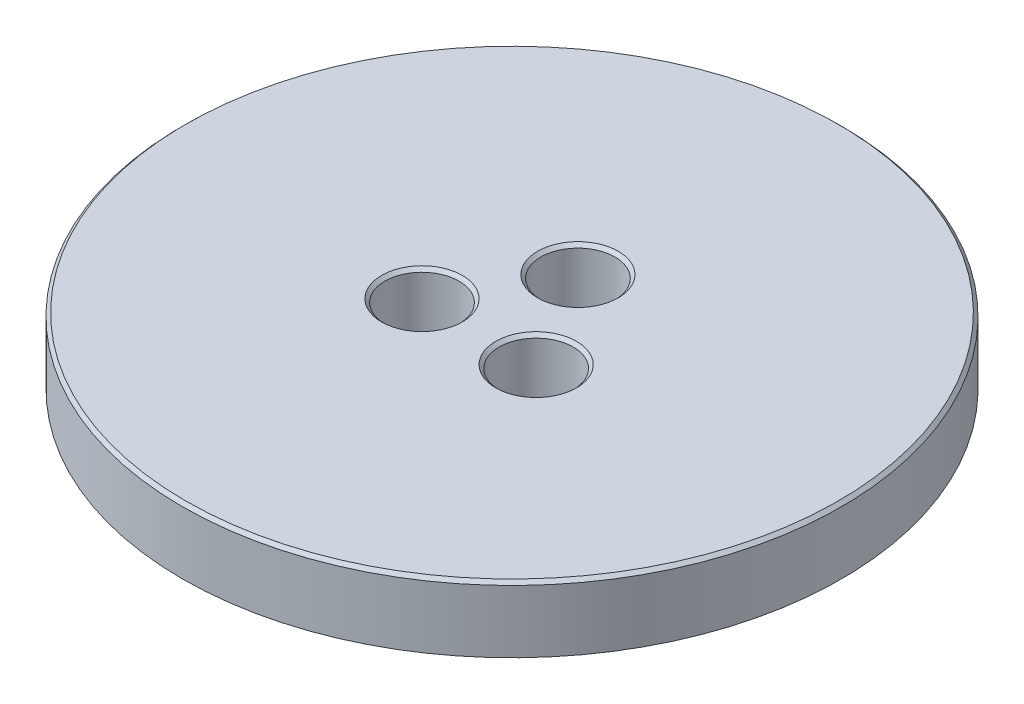
ISO-10303-21;
HEADER;
FILE_DESCRIPTION(('STEP AP214'),'2;1');
FILE_NAME('part.step','',(''),(''),'','','');
FILE_SCHEMA(('AUTOMOTIVE_DESIGN { 1 0 10303 214 1 1 1 1 }'));
ENDSEC;
DATA;
#1=APPLICATION_CONTEXT('core data for automotive mechanical design processes');
#2=APPLICATION_PROTOCOL_DEFINITION('international standard','automotive_design',2000,#1);
#3=PRODUCT_CONTEXT('',#1,'mechanical');
#4=PRODUCT('Part','Part','',(#3));
#5=PRODUCT_RELATED_PRODUCT_CATEGORY('part','',(#4));
#6=PRODUCT_DEFINITION_FORMATION('','',#4);
#7=PRODUCT_DEFINITION_CONTEXT('part definition',#1,'design');
#8=PRODUCT_DEFINITION('design','',#6,#7);
#9=PRODUCT_DEFINITION_SHAPE('','',#8);
#10=(LENGTH_UNIT() NAMED_UNIT(*) SI_UNIT(.MILLI.,.METRE.));
#11=(NAMED_UNIT(*) PLANE_ANGLE_UNIT() SI_UNIT($,.RADIAN.));
#12=(NAMED_UNIT(*) SI_UNIT($,.STERADIAN.) SOLID_ANGLE_UNIT());
#13=UNCERTAINTY_MEASURE_WITH_UNIT(LENGTH_MEASURE(1.E-05),#10,'distance_accuracy_value','');
#14=(GEOMETRIC_REPRESENTATION_CONTEXT(3) GLOBAL_UNCERTAINTY_ASSIGNED_CONTEXT((#13)) GLOBAL_UNIT_ASSIGNED_CONTEXT((#10,
#11,#12)) REPRESENTATION_CONTEXT('',''));
#15=CARTESIAN_POINT('',(0.,0.,0.));
#16=DIRECTION('',(0.,0.,1.));
#17=DIRECTION('',(1.,0.,0.));
#18=AXIS2_PLACEMENT_3D('',#15,#16,#17);
#19=CARTESIAN_POINT('',(0.,2.,0.));
#20=DIRECTION('',(0.,1.,0.));
#21=DIRECTION('',(0.,0.,1.));
#22=AXIS2_PLACEMENT_3D('',#19,#20,#21);
#23=PLANE('',#22);
#24=CARTESIAN_POINT('',(0.,2.,0.));
#25=DIRECTION('',(0.,1.,0.));
#26=DIRECTION('',(0.,0.,1.));
#27=AXIS2_PLACEMENT_3D('',#24,#25,#26);
#28=CIRCLE('',#27,9.9);
#29=CARTESIAN_POINT('',(0.,2.,9.9));
#30=VERTEX_POINT('',#29);
#31=EDGE_CURVE('E50',#30,#30,#28,.T.);
#32=ORIENTED_EDGE('',*,*,#31,.T.);
#33=EDGE_LOOP('',(#32));
#34=FACE_BOUND('',#33,.T.);
#35=CARTESIAN_POINT('',(1.73205080756888,2.,1.));
#36=DIRECTION('',(0.,1.,0.));
#37=DIRECTION('',(0.,0.,1.));
#38=AXIS2_PLACEMENT_3D('',#35,#36,#37);
#39=CIRCLE('',#38,1.225);
#40=CARTESIAN_POINT('',(1.73205080756888,2.,2.225));
#41=VERTEX_POINT('',#40);
#42=EDGE_CURVE('E55',#41,#41,#39,.F.);
#43=ORIENTED_EDGE('',*,*,#42,.T.);
#44=EDGE_LOOP('',(#43));
#45=FACE_BOUND('',#44,.T.);
#46=CARTESIAN_POINT('',(-1.73205080756888,2.,1.));
#47=DIRECTION('',(0.,1.,0.));
#48=DIRECTION('',(0.,0.,1.));
#49=AXIS2_PLACEMENT_3D('',#46,#47,#48);
#50=CIRCLE('',#49,1.225);
#51=CARTESIAN_POINT('',(-1.73205080756888,2.,2.225));
#52=VERTEX_POINT('',#51);
#53=EDGE_CURVE('E58',#52,#52,#50,.F.);
#54=ORIENTED_EDGE('',*,*,#53,.T.);
#55=EDGE_LOOP('',(#54));
#56=FACE_BOUND('',#55,.T.);
#57=CARTESIAN_POINT('',(0.,2.,-2.));
#58=DIRECTION('',(0.,1.,0.));
#59=DIRECTION('',(0.,0.,1.));
#60=AXIS2_PLACEMENT_3D('',#57,#58,#59);
#61=CIRCLE('',#60,1.225);
#62=CARTESIAN_POINT('',(0.,2.,-0.775));
#63=VERTEX_POINT('',#62);
#64=EDGE_CURVE('E61',#63,#63,#61,.F.);
#65=ORIENTED_EDGE('',*,*,#64,.T.);
#66=EDGE_LOOP('',(#65));
#67=FACE_BOUND('',#66,.T.);
#68=ADVANCED_FACE('F34',(#34,#45,#56,#67),#23,.T.);
#69=CARTESIAN_POINT('',(0.,0.,0.));
#70=DIRECTION('',(0.,-1.,0.));
#71=DIRECTION('',(0.,0.,-1.));
#72=AXIS2_PLACEMENT_3D('',#69,#70,#71);
#73=CYLINDRICAL_SURFACE('',#72,10.);
#74=CARTESIAN_POINT('',(0.,1.9,0.));
#75=DIRECTION('',(0.,1.,0.));
#76=DIRECTION('',(0.,0.,1.));
#77=AXIS2_PLACEMENT_3D('',#74,#75,#76);
#78=CIRCLE('',#77,10.);
#79=CARTESIAN_POINT('',(0.,1.9,10.));
#80=VERTEX_POINT('',#79);
#81=EDGE_CURVE('E64',#80,#80,#78,.F.);
#82=ORIENTED_EDGE('',*,*,#81,.T.);
#83=EDGE_LOOP('',(#82));
#84=FACE_BOUND('',#83,.T.);
#85=CARTESIAN_POINT('',(0.,0.,0.));
#86=DIRECTION('',(0.,-1.,0.));
#87=DIRECTION('',(0.,0.,-1.));
#88=AXIS2_PLACEMENT_3D('',#85,#86,#87);
#89=CIRCLE('',#88,10.);
#90=CARTESIAN_POINT('',(0.,0.,-10.));
#91=VERTEX_POINT('',#90);
#92=EDGE_CURVE('E67',#91,#91,#89,.T.);
#93=ORIENTED_EDGE('',*,*,#92,.F.);
#94=EDGE_LOOP('',(#93));
#95=FACE_BOUND('',#94,.T.);
#96=ADVANCED_FACE('F98',(#84,#95),#73,.T.);
#97=CARTESIAN_POINT('',(0.,0.,0.));
#98=DIRECTION('',(0.,-1.,0.));
#99=DIRECTION('',(0.,0.,-1.));
#100=AXIS2_PLACEMENT_3D('',#97,#98,#99);
#101=PLANE('',#100);
#102=CARTESIAN_POINT('',(0.,0.,-2.));
#103=DIRECTION('',(0.,1.,0.));
#104=DIRECTION('',(0.,0.,1.));
#105=AXIS2_PLACEMENT_3D('',#102,#103,#104);
#106=CIRCLE('',#105,1.125);
#107=CARTESIAN_POINT('',(0.,0.,-0.875));
#108=VERTEX_POINT('',#107);
#109=EDGE_CURVE('E70',#108,#108,#106,.T.);
#110=ORIENTED_EDGE('',*,*,#109,.T.);
#111=EDGE_LOOP('',(#110));
#112=FACE_BOUND('',#111,.T.);
#113=CARTESIAN_POINT('',(-1.73205080756888,0.,1.));
#114=DIRECTION('',(0.,1.,0.));
#115=DIRECTION('',(0.,0.,1.));
#116=AXIS2_PLACEMENT_3D('',#113,#114,#115);
#117=CIRCLE('',#116,1.125);
#118=CARTESIAN_POINT('',(-1.73205080756888,0.,2.125));
#119=VERTEX_POINT('',#118);
#120=EDGE_CURVE('E74',#119,#119,#117,.T.);
#121=ORIENTED_EDGE('',*,*,#120,.T.);
#122=EDGE_LOOP('',(#121));
#123=FACE_BOUND('',#122,.T.);
#124=CARTESIAN_POINT('',(1.73205080756888,0.,1.));
#125=DIRECTION('',(0.,1.,0.));
#126=DIRECTION('',(0.,0.,1.));
#127=AXIS2_PLACEMENT_3D('',#124,#125,#126);
#128=CIRCLE('',#127,1.125);
#129=CARTESIAN_POINT('',(1.73205080756888,0.,2.125));
#130=VERTEX_POINT('',#129);
#131=EDGE_CURVE('E71',#130,#130,#128,.T.);
#132=ORIENTED_EDGE('',*,*,#131,.T.);
#133=EDGE_LOOP('',(#132));
#134=FACE_BOUND('',#133,.T.);
#135=ORIENTED_EDGE('',*,*,#92,.T.);
#136=EDGE_LOOP('',(#135));
#137=FACE_BOUND('',#136,.T.);
#138=ADVANCED_FACE('F80',(#112,#123,#134,#137),#101,.T.);
#139=CARTESIAN_POINT('',(1.73205080756888,2.,1.));
#140=DIRECTION('',(0.,-1.,0.));
#141=DIRECTION('',(0.,0.,-1.));
#142=AXIS2_PLACEMENT_3D('',#139,#140,#141);
#143=CYLINDRICAL_SURFACE('',#142,1.125);
#144=CARTESIAN_POINT('',(1.73205080756888,1.9,1.));
#145=DIRECTION('',(0.,1.,0.));
#146=DIRECTION('',(0.,0.,1.));
#147=AXIS2_PLACEMENT_3D('',#144,#145,#146);
#148=CIRCLE('',#147,1.125);
#149=CARTESIAN_POINT('',(1.73205080756888,1.9,2.125));
#150=VERTEX_POINT('',#149);
#151=EDGE_CURVE('E46',#150,#150,#148,.T.);
#152=ORIENTED_EDGE('',*,*,#151,.T.);
#153=EDGE_LOOP('',(#152));
#154=FACE_BOUND('',#153,.T.);
#155=ORIENTED_EDGE('',*,*,#131,.F.);
#156=EDGE_LOOP('',(#155));
#157=FACE_BOUND('',#156,.T.);
#158=ADVANCED_FACE('F95',(#154,#157),#143,.F.);
#159=CARTESIAN_POINT('',(-1.73205080756888,2.,1.));
#160=DIRECTION('',(0.,-1.,0.));
#161=DIRECTION('',(0.,0.,-1.));
#162=AXIS2_PLACEMENT_3D('',#159,#160,#161);
#163=CYLINDRICAL_SURFACE('',#162,1.125);
#164=CARTESIAN_POINT('',(-1.73205080756888,1.9,1.));
#165=DIRECTION('',(0.,1.,0.));
#166=DIRECTION('',(0.,0.,1.));
#167=AXIS2_PLACEMENT_3D('',#164,#165,#166);
#168=CIRCLE('',#167,1.125);
#169=CARTESIAN_POINT('',(-1.73205080756888,1.9,2.125));
#170=VERTEX_POINT('',#169);
#171=EDGE_CURVE('E42',#170,#170,#168,.T.);
#172=ORIENTED_EDGE('',*,*,#171,.T.);
#173=EDGE_LOOP('',(#172));
#174=FACE_BOUND('',#173,.T.);
#175=ORIENTED_EDGE('',*,*,#120,.F.);
#176=EDGE_LOOP('',(#175));
#177=FACE_BOUND('',#176,.T.);
#178=ADVANCED_FACE('F86',(#174,#177),#163,.F.);
#179=CARTESIAN_POINT('',(0.,2.,-2.));
#180=DIRECTION('',(0.,-1.,0.));
#181=DIRECTION('',(0.,0.,-1.));
#182=AXIS2_PLACEMENT_3D('',#179,#180,#181);
#183=CYLINDRICAL_SURFACE('',#182,1.125);
#184=CARTESIAN_POINT('',(0.,1.9,-2.));
#185=DIRECTION('',(0.,1.,0.));
#186=DIRECTION('',(0.,0.,1.));
#187=AXIS2_PLACEMENT_3D('',#184,#185,#186);
#188=CIRCLE('',#187,1.125);
#189=CARTESIAN_POINT('',(0.,1.9,-0.875));
#190=VERTEX_POINT('',#189);
#191=EDGE_CURVE('E10',#190,#190,#188,.T.);
#192=ORIENTED_EDGE('',*,*,#191,.T.);
#193=EDGE_LOOP('',(#192));
#194=FACE_BOUND('',#193,.T.);
#195=ORIENTED_EDGE('',*,*,#109,.F.);
#196=EDGE_LOOP('',(#195));
#197=FACE_BOUND('',#196,.T.);
#198=ADVANCED_FACE('F83',(#194,#197),#183,.F.);
#199=CARTESIAN_POINT('',(0.,1.9,0.));
#200=DIRECTION('',(0.,-1.,0.));
#201=DIRECTION('',(0.,0.,-1.));
#202=AXIS2_PLACEMENT_3D('',#199,#200,#201);
#203=CONICAL_SURFACE('',#202,10.,0.785398163397448);
#204=ORIENTED_EDGE('',*,*,#31,.F.);
#205=EDGE_LOOP('',(#204));
#206=FACE_BOUND('',#205,.T.);
#207=ORIENTED_EDGE('',*,*,#81,.F.);
#208=EDGE_LOOP('',(#207));
#209=FACE_BOUND('',#208,.T.);
#210=ADVANCED_FACE('F85',(#206,#209),#203,.T.);
#211=CARTESIAN_POINT('',(1.73205080756888,1.9,1.));
#212=DIRECTION('',(0.,1.,0.));
#213=DIRECTION('',(0.,0.,1.));
#214=AXIS2_PLACEMENT_3D('',#211,#212,#213);
#215=CONICAL_SURFACE('',#214,1.125,0.785398163397435);
#216=ORIENTED_EDGE('',*,*,#42,.F.);
#217=EDGE_LOOP('',(#216));
#218=FACE_BOUND('',#217,.T.);
#219=ORIENTED_EDGE('',*,*,#151,.F.);
#220=EDGE_LOOP('',(#219));
#221=FACE_BOUND('',#220,.T.);
#222=ADVANCED_FACE('F92',(#218,#221),#215,.F.);
#223=CARTESIAN_POINT('',(-1.73205080756888,1.9,1.));
#224=DIRECTION('',(0.,1.,0.));
#225=DIRECTION('',(0.,0.,1.));
#226=AXIS2_PLACEMENT_3D('',#223,#224,#225);
#227=CONICAL_SURFACE('',#226,1.125,0.785398163397435);
#228=ORIENTED_EDGE('',*,*,#53,.F.);
#229=EDGE_LOOP('',(#228));
#230=FACE_BOUND('',#229,.T.);
#231=ORIENTED_EDGE('',*,*,#171,.F.);
#232=EDGE_LOOP('',(#231));
#233=FACE_BOUND('',#232,.T.);
#234=ADVANCED_FACE('F117',(#230,#233),#227,.F.);
#235=CARTESIAN_POINT('',(0.,1.9,-2.));
#236=DIRECTION('',(0.,1.,0.));
#237=DIRECTION('',(0.,0.,1.));
#238=AXIS2_PLACEMENT_3D('',#235,#236,#237);
#239=CONICAL_SURFACE('',#238,1.125,0.785398163397435);
#240=ORIENTED_EDGE('',*,*,#64,.F.);
#241=EDGE_LOOP('',(#240));
#242=FACE_BOUND('',#241,.T.);
#243=ORIENTED_EDGE('',*,*,#191,.F.);
#244=EDGE_LOOP('',(#243));
#245=FACE_BOUND('',#244,.T.);
#246=ADVANCED_FACE('F37',(#242,#245),#239,.F.);
#247=CLOSED_SHELL('',(#68,#96,#138,#158,#178,#198,#210,#222,#234,#246));
#248=MANIFOLD_SOLID_BREP('B2',#247);
#249=ADVANCED_BREP_SHAPE_REPRESENTATION('',(#18,#248),#14);
#250=SHAPE_DEFINITION_REPRESENTATION(#9,#249);
ENDSEC;
END-ISO-10303-21;
